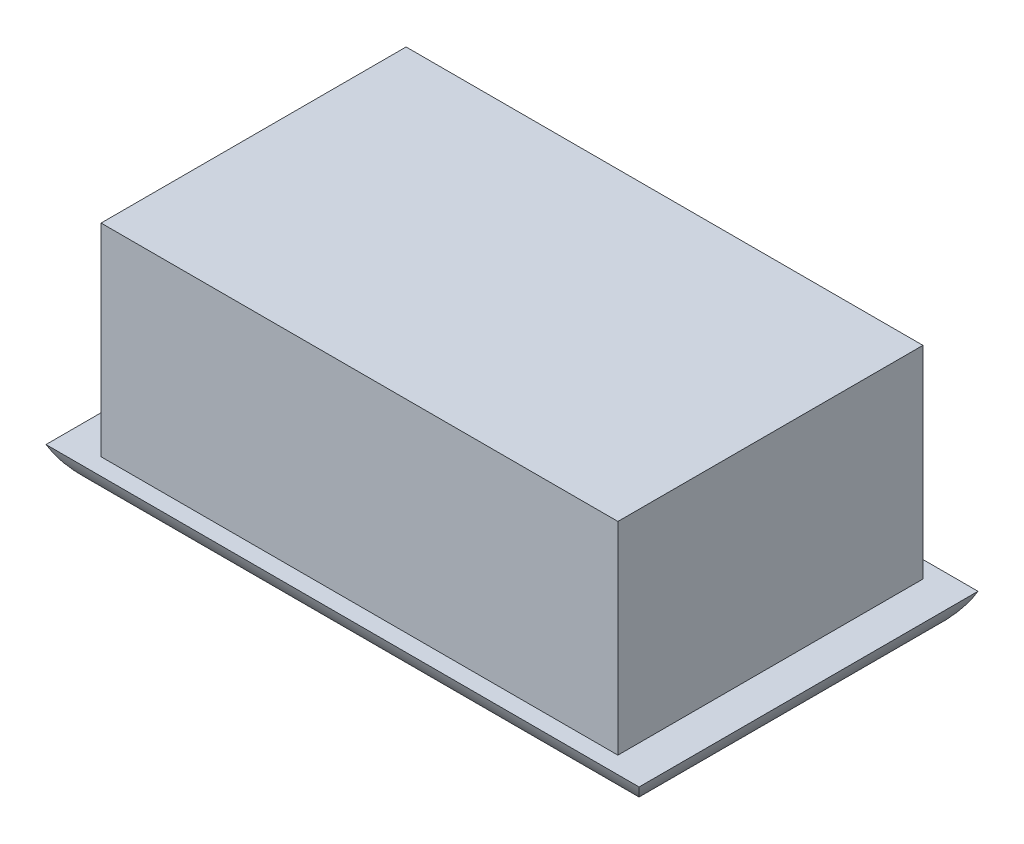
ISO-10303-21;
HEADER;
FILE_DESCRIPTION(('STEP AP214'),'2;1');
FILE_NAME('part.step','',(''),(''),'','','');
FILE_SCHEMA(('AUTOMOTIVE_DESIGN { 1 0 10303 214 1 1 1 1 }'));
ENDSEC;
DATA;
#1=APPLICATION_CONTEXT('core data for automotive mechanical design processes');
#2=APPLICATION_PROTOCOL_DEFINITION('international standard','automotive_design',2000,#1);
#3=PRODUCT_CONTEXT('',#1,'mechanical');
#4=PRODUCT('Part','Part','',(#3));
#5=PRODUCT_RELATED_PRODUCT_CATEGORY('part','',(#4));
#6=PRODUCT_DEFINITION_FORMATION('','',#4);
#7=PRODUCT_DEFINITION_CONTEXT('part definition',#1,'design');
#8=PRODUCT_DEFINITION('design','',#6,#7);
#9=PRODUCT_DEFINITION_SHAPE('','',#8);
#10=(LENGTH_UNIT() NAMED_UNIT(*) SI_UNIT(.MILLI.,.METRE.));
#11=(NAMED_UNIT(*) PLANE_ANGLE_UNIT() SI_UNIT($,.RADIAN.));
#12=(NAMED_UNIT(*) SI_UNIT($,.STERADIAN.) SOLID_ANGLE_UNIT());
#13=UNCERTAINTY_MEASURE_WITH_UNIT(LENGTH_MEASURE(1.E-05),#10,'distance_accuracy_value','');
#14=(GEOMETRIC_REPRESENTATION_CONTEXT(3) GLOBAL_UNCERTAINTY_ASSIGNED_CONTEXT((#13)) GLOBAL_UNIT_ASSIGNED_CONTEXT((#10,
#11,#12)) REPRESENTATION_CONTEXT('',''));
#15=CARTESIAN_POINT('',(0.,0.,0.));
#16=DIRECTION('',(0.,0.,1.));
#17=DIRECTION('',(1.,0.,0.));
#18=AXIS2_PLACEMENT_3D('',#15,#16,#17);
#19=CARTESIAN_POINT('',(25.7872555341905,-20.,-20.));
#20=DIRECTION('',(0.,0.,-1.));
#21=DIRECTION('',(-1.,0.,0.));
#22=AXIS2_PLACEMENT_3D('',#19,#20,#21);
#23=CYLINDRICAL_SURFACE('',#22,10.);
#24=CARTESIAN_POINT('',(25.7872555341905,-20.,-10.7872555341905));
#25=DIRECTION('',(0.707106781186548,0.,0.707106781186548));
#26=DIRECTION('',(-0.707106781186548,0.,0.707106781186548));
#27=AXIS2_PLACEMENT_3D('',#24,#25,#26);
#28=ELLIPSE('',#27,14.1421356237309,10.);
#29=CARTESIAN_POINT('',(25.7872555341905,-30.,-10.7872555341905));
#30=VERTEX_POINT('',#29);
#31=CARTESIAN_POINT('',(35.,-23.8891309321872,-20.));
#32=VERTEX_POINT('',#31);
#33=EDGE_CURVE('E20',#30,#32,#28,.T.);
#34=ORIENTED_EDGE('',*,*,#33,.T.);
#35=DIRECTION('',(0.,0.,1.));
#36=VECTOR('',#35,1.);
#37=CARTESIAN_POINT('',(35.,-23.8891309321872,-20.));
#38=LINE('',#37,#36);
#39=CARTESIAN_POINT('',(35.,-23.8891309321872,20.));
#40=VERTEX_POINT('',#39);
#41=EDGE_CURVE('E195',#32,#40,#38,.T.);
#42=ORIENTED_EDGE('',*,*,#41,.T.);
#43=CARTESIAN_POINT('',(25.7872555341905,-20.,10.7872555341905));
#44=DIRECTION('',(0.707106781186548,0.,-0.707106781186548));
#45=DIRECTION('',(0.707106781186548,0.,0.707106781186548));
#46=AXIS2_PLACEMENT_3D('',#43,#44,#45);
#47=ELLIPSE('',#46,14.1421356237309,10.);
#48=CARTESIAN_POINT('',(25.7872555341905,-30.,10.7872555341905));
#49=VERTEX_POINT('',#48);
#50=EDGE_CURVE('E11',#40,#49,#47,.T.);
#51=ORIENTED_EDGE('',*,*,#50,.T.);
#52=DIRECTION('',(0.,0.,1.));
#53=VECTOR('',#52,1.);
#54=CARTESIAN_POINT('',(25.7872555341905,-30.,20.));
#55=LINE('',#54,#53);
#56=EDGE_CURVE('E258',#30,#49,#55,.T.);
#57=ORIENTED_EDGE('',*,*,#56,.F.);
#58=EDGE_LOOP('',(#34,#42,#51,#57));
#59=FACE_BOUND('',#58,.T.);
#60=ADVANCED_FACE('F17',(#59),#23,.T.);
#61=CARTESIAN_POINT('',(35.,-20.,10.7872555341905));
#62=DIRECTION('',(1.,0.,0.));
#63=DIRECTION('',(0.,0.,-1.));
#64=AXIS2_PLACEMENT_3D('',#61,#62,#63);
#65=CYLINDRICAL_SURFACE('',#64,10.);
#66=CARTESIAN_POINT('',(19.3495577730773,-20.,10.7872555341905));
#67=DIRECTION('',(-0.707106781186548,0.,-0.707106781186548));
#68=DIRECTION('',(0.707106781186548,0.,-0.707106781186548));
#69=AXIS2_PLACEMENT_3D('',#66,#67,#68);
#70=ELLIPSE('',#69,14.1421356237309,10.);
#71=CARTESIAN_POINT('',(19.3495577730773,-30.,10.7872555341905));
#72=VERTEX_POINT('',#71);
#73=CARTESIAN_POINT('',(17.5684066536339,-29.8400965792875,12.5684066536339));
#74=VERTEX_POINT('',#73);
#75=EDGE_CURVE('E219',#72,#74,#70,.T.);
#76=ORIENTED_EDGE('',*,*,#75,.F.);
#77=DIRECTION('',(-1.,0.,0.));
#78=VECTOR('',#77,1.);
#79=CARTESIAN_POINT('',(-35.,-30.,10.7872555341905));
#80=LINE('',#79,#78);
#81=EDGE_CURVE('E616',#49,#72,#80,.T.);
#82=ORIENTED_EDGE('',*,*,#81,.F.);
#83=ORIENTED_EDGE('',*,*,#50,.F.);
#84=DIRECTION('',(-1.,0.,0.));
#85=VECTOR('',#84,1.);
#86=CARTESIAN_POINT('',(35.,-23.8891309321872,20.));
#87=LINE('',#86,#85);
#88=CARTESIAN_POINT('',(-35.,-23.8891309321872,20.));
#89=VERTEX_POINT('',#88);
#90=EDGE_CURVE('E191',#40,#89,#87,.T.);
#91=ORIENTED_EDGE('',*,*,#90,.T.);
#92=CARTESIAN_POINT('',(-25.7872555341905,-20.,10.7872555341905));
#93=DIRECTION('',(0.707106781186548,0.,0.707106781186548));
#94=DIRECTION('',(-0.707106781186548,0.,0.707106781186548));
#95=AXIS2_PLACEMENT_3D('',#92,#93,#94);
#96=ELLIPSE('',#95,14.1421356237309,10.);
#97=CARTESIAN_POINT('',(-25.7872555341905,-30.,10.7872555341905));
#98=VERTEX_POINT('',#97);
#99=EDGE_CURVE('E242',#89,#98,#96,.T.);
#100=ORIENTED_EDGE('',*,*,#99,.T.);
#101=DIRECTION('',(-1.,0.,0.));
#102=VECTOR('',#101,1.);
#103=CARTESIAN_POINT('',(-35.,-30.,10.7872555341905));
#104=LINE('',#103,#102);
#105=CARTESIAN_POINT('',(-19.3495577730773,-30.,10.7872555341905));
#106=VERTEX_POINT('',#105);
#107=EDGE_CURVE('E211',#106,#98,#104,.T.);
#108=ORIENTED_EDGE('',*,*,#107,.F.);
#109=CARTESIAN_POINT('',(-19.3495577730773,-20.,10.7872555341905));
#110=DIRECTION('',(0.707106781186548,0.,-0.707106781186548));
#111=DIRECTION('',(0.707106781186548,0.,0.707106781186548));
#112=AXIS2_PLACEMENT_3D('',#109,#110,#111);
#113=ELLIPSE('',#112,14.1421356237309,10.);
#114=CARTESIAN_POINT('',(-17.5684066536339,-29.8400965792875,12.5684066536339));
#115=VERTEX_POINT('',#114);
#116=EDGE_CURVE('E148',#115,#106,#113,.T.);
#117=ORIENTED_EDGE('',*,*,#116,.F.);
#118=DIRECTION('',(-1.,0.,0.));
#119=VECTOR('',#118,1.);
#120=CARTESIAN_POINT('',(17.5684066536339,-29.8400965792875,12.5684066536339));
#121=LINE('',#120,#119);
#122=EDGE_CURVE('E39',#74,#115,#121,.T.);
#123=ORIENTED_EDGE('',*,*,#122,.F.);
#124=EDGE_LOOP('',(#76,#82,#83,#91,#100,#108,#117,#123));
#125=FACE_BOUND('',#124,.T.);
#126=ADVANCED_FACE('F269',(#125),#65,.T.);
#127=CARTESIAN_POINT('',(-35.,-20.,-10.7872555341905));
#128=DIRECTION('',(-1.,0.,0.));
#129=DIRECTION('',(0.,0.,1.));
#130=AXIS2_PLACEMENT_3D('',#127,#128,#129);
#131=CYLINDRICAL_SURFACE('',#130,10.);
#132=CARTESIAN_POINT('',(-25.7872555341905,-20.,-10.7872555341905));
#133=DIRECTION('',(0.707106781186548,0.,-0.707106781186548));
#134=DIRECTION('',(0.707106781186548,0.,0.707106781186548));
#135=AXIS2_PLACEMENT_3D('',#132,#133,#134);
#136=ELLIPSE('',#135,14.1421356237309,10.);
#137=CARTESIAN_POINT('',(-25.7872555341905,-30.,-10.7872555341905));
#138=VERTEX_POINT('',#137);
#139=CARTESIAN_POINT('',(-35.,-23.8891309321872,-20.));
#140=VERTEX_POINT('',#139);
#141=EDGE_CURVE('E244',#138,#140,#136,.T.);
#142=ORIENTED_EDGE('',*,*,#141,.T.);
#143=DIRECTION('',(1.,0.,0.));
#144=VECTOR('',#143,1.);
#145=CARTESIAN_POINT('',(-35.,-23.8891309321872,-20.));
#146=LINE('',#145,#144);
#147=EDGE_CURVE('E183',#140,#32,#146,.T.);
#148=ORIENTED_EDGE('',*,*,#147,.T.);
#149=ORIENTED_EDGE('',*,*,#33,.F.);
#150=DIRECTION('',(1.,0.,0.));
#151=VECTOR('',#150,1.);
#152=CARTESIAN_POINT('',(35.,-30.,-10.7872555341905));
#153=LINE('',#152,#151);
#154=CARTESIAN_POINT('',(19.3495577730773,-30.,-10.7872555341905));
#155=VERTEX_POINT('',#154);
#156=EDGE_CURVE('E626',#155,#30,#153,.T.);
#157=ORIENTED_EDGE('',*,*,#156,.F.);
#158=CARTESIAN_POINT('',(19.3495577730773,-20.,-10.7872555341905));
#159=DIRECTION('',(-0.707106781186548,0.,0.707106781186548));
#160=DIRECTION('',(-0.707106781186548,0.,-0.707106781186548));
#161=AXIS2_PLACEMENT_3D('',#158,#159,#160);
#162=ELLIPSE('',#161,14.1421356237309,10.);
#163=CARTESIAN_POINT('',(17.5684066536339,-29.8400965792875,-12.5684066536339));
#164=VERTEX_POINT('',#163);
#165=EDGE_CURVE('E215',#164,#155,#162,.T.);
#166=ORIENTED_EDGE('',*,*,#165,.F.);
#167=DIRECTION('',(1.,0.,0.));
#168=VECTOR('',#167,1.);
#169=CARTESIAN_POINT('',(-17.5684066536339,-29.8400965792875,-12.5684066536339));
#170=LINE('',#169,#168);
#171=CARTESIAN_POINT('',(-17.5684066536339,-29.8400965792875,-12.5684066536339));
#172=VERTEX_POINT('',#171);
#173=EDGE_CURVE('E225',#172,#164,#170,.T.);
#174=ORIENTED_EDGE('',*,*,#173,.F.);
#175=CARTESIAN_POINT('',(-19.3495577730773,-20.,-10.7872555341905));
#176=DIRECTION('',(0.707106781186548,0.,0.707106781186548));
#177=DIRECTION('',(-0.707106781186548,0.,0.707106781186548));
#178=AXIS2_PLACEMENT_3D('',#175,#176,#177);
#179=ELLIPSE('',#178,14.1421356237309,10.);
#180=CARTESIAN_POINT('',(-19.3495577730773,-30.,-10.7872555341905));
#181=VERTEX_POINT('',#180);
#182=EDGE_CURVE('E149',#181,#172,#179,.T.);
#183=ORIENTED_EDGE('',*,*,#182,.F.);
#184=DIRECTION('',(1.,0.,0.));
#185=VECTOR('',#184,1.);
#186=CARTESIAN_POINT('',(35.,-30.,-10.7872555341905));
#187=LINE('',#186,#185);
#188=EDGE_CURVE('E203',#138,#181,#187,.T.);
#189=ORIENTED_EDGE('',*,*,#188,.F.);
#190=EDGE_LOOP('',(#142,#148,#149,#157,#166,#174,#183,#189));
#191=FACE_BOUND('',#190,.T.);
#192=ADVANCED_FACE('F266',(#191),#131,.T.);
#193=CARTESIAN_POINT('',(-25.7872555341905,-20.,20.));
#194=DIRECTION('',(0.,0.,1.));
#195=DIRECTION('',(1.,0.,0.));
#196=AXIS2_PLACEMENT_3D('',#193,#194,#195);
#197=CYLINDRICAL_SURFACE('',#196,10.);
#198=ORIENTED_EDGE('',*,*,#99,.F.);
#199=DIRECTION('',(0.,0.,-1.));
#200=VECTOR('',#199,1.);
#201=CARTESIAN_POINT('',(-35.,-23.8891309321872,20.));
#202=LINE('',#201,#200);
#203=EDGE_CURVE('E187',#89,#140,#202,.T.);
#204=ORIENTED_EDGE('',*,*,#203,.T.);
#205=ORIENTED_EDGE('',*,*,#141,.F.);
#206=DIRECTION('',(0.,0.,-1.));
#207=VECTOR('',#206,1.);
#208=CARTESIAN_POINT('',(-25.7872555341905,-30.,-20.));
#209=LINE('',#208,#207);
#210=EDGE_CURVE('E199',#98,#138,#209,.T.);
#211=ORIENTED_EDGE('',*,*,#210,.F.);
#212=EDGE_LOOP('',(#198,#204,#205,#211));
#213=FACE_BOUND('',#212,.T.);
#214=ADVANCED_FACE('F268',(#213),#197,.T.);
#215=CARTESIAN_POINT('',(12.5,-20.,14.3495577730773));
#216=DIRECTION('',(1.,0.,0.));
#217=DIRECTION('',(0.,0.,-1.));
#218=AXIS2_PLACEMENT_3D('',#215,#216,#217);
#219=CYLINDRICAL_SURFACE('',#218,10.);
#220=CARTESIAN_POINT('',(19.3495577730773,-20.,14.3495577730773));
#221=DIRECTION('',(-0.707106781186548,0.,0.707106781186548));
#222=DIRECTION('',(0.707106781186548,0.,0.707106781186548));
#223=AXIS2_PLACEMENT_3D('',#220,#221,#222);
#224=ELLIPSE('',#223,14.1421356237309,10.);
#225=CARTESIAN_POINT('',(12.5,-27.2858464376678,7.5));
#226=VERTEX_POINT('',#225);
#227=EDGE_CURVE('E235',#226,#74,#224,.T.);
#228=ORIENTED_EDGE('',*,*,#227,.T.);
#229=ORIENTED_EDGE('',*,*,#122,.T.);
#230=CARTESIAN_POINT('',(-19.3495577730773,-20.,14.3495577730773));
#231=DIRECTION('',(0.707106781186548,0.,0.707106781186548));
#232=DIRECTION('',(0.707106781186548,0.,-0.707106781186548));
#233=AXIS2_PLACEMENT_3D('',#230,#231,#232);
#234=ELLIPSE('',#233,14.1421356237309,10.);
#235=CARTESIAN_POINT('',(-12.5,-27.2858464376678,7.5));
#236=VERTEX_POINT('',#235);
#237=EDGE_CURVE('E140',#115,#236,#234,.T.);
#238=ORIENTED_EDGE('',*,*,#237,.T.);
#239=DIRECTION('',(-1.,0.,0.));
#240=VECTOR('',#239,1.);
#241=CARTESIAN_POINT('',(12.5,-27.2858464376678,7.5));
#242=LINE('',#241,#240);
#243=EDGE_CURVE('E144',#226,#236,#242,.T.);
#244=ORIENTED_EDGE('',*,*,#243,.F.);
#245=EDGE_LOOP('',(#228,#229,#238,#244));
#246=FACE_BOUND('',#245,.T.);
#247=ADVANCED_FACE('F142',(#246),#219,.T.);
#248=CARTESIAN_POINT('',(-19.3495577730773,-20.,7.5));
#249=DIRECTION('',(0.,0.,1.));
#250=DIRECTION('',(1.,0.,0.));
#251=AXIS2_PLACEMENT_3D('',#248,#249,#250);
#252=CYLINDRICAL_SURFACE('',#251,10.);
#253=DIRECTION('',(0.,0.,1.));
#254=VECTOR('',#253,1.);
#255=CARTESIAN_POINT('',(-19.3495577730773,-30.,7.5));
#256=LINE('',#255,#254);
#257=EDGE_CURVE('E207',#181,#106,#256,.T.);
#258=ORIENTED_EDGE('',*,*,#257,.F.);
#259=ORIENTED_EDGE('',*,*,#182,.T.);
#260=CARTESIAN_POINT('',(-19.3495577730773,-20.,-14.3495577730773));
#261=DIRECTION('',(-0.707106781186548,0.,0.707106781186548));
#262=DIRECTION('',(0.707106781186548,0.,0.707106781186548));
#263=AXIS2_PLACEMENT_3D('',#260,#261,#262);
#264=ELLIPSE('',#263,14.1421356237309,10.);
#265=CARTESIAN_POINT('',(-12.5,-27.2858464376678,-7.5));
#266=VERTEX_POINT('',#265);
#267=EDGE_CURVE('E156',#172,#266,#264,.T.);
#268=ORIENTED_EDGE('',*,*,#267,.T.);
#269=DIRECTION('',(0.,0.,-1.));
#270=VECTOR('',#269,1.);
#271=CARTESIAN_POINT('',(-12.5,-27.2858464376678,7.5));
#272=LINE('',#271,#270);
#273=EDGE_CURVE('E152',#236,#266,#272,.T.);
#274=ORIENTED_EDGE('',*,*,#273,.F.);
#275=ORIENTED_EDGE('',*,*,#237,.F.);
#276=ORIENTED_EDGE('',*,*,#116,.T.);
#277=EDGE_LOOP('',(#258,#259,#268,#274,#275,#276));
#278=FACE_BOUND('',#277,.T.);
#279=ADVANCED_FACE('F154',(#278),#252,.T.);
#280=CARTESIAN_POINT('',(19.3495577730773,-20.,-7.5));
#281=DIRECTION('',(0.,0.,-1.));
#282=DIRECTION('',(-1.,0.,0.));
#283=AXIS2_PLACEMENT_3D('',#280,#281,#282);
#284=CYLINDRICAL_SURFACE('',#283,10.);
#285=CARTESIAN_POINT('',(19.3495577730773,-20.,-14.3495577730773));
#286=DIRECTION('',(0.707106781186548,0.,0.707106781186548));
#287=DIRECTION('',(0.707106781186548,0.,-0.707106781186548));
#288=AXIS2_PLACEMENT_3D('',#285,#286,#287);
#289=ELLIPSE('',#288,14.1421356237309,10.);
#290=CARTESIAN_POINT('',(12.5,-27.2858464376678,-7.5));
#291=VERTEX_POINT('',#290);
#292=EDGE_CURVE('E220',#291,#164,#289,.T.);
#293=ORIENTED_EDGE('',*,*,#292,.T.);
#294=ORIENTED_EDGE('',*,*,#165,.T.);
#295=DIRECTION('',(0.,0.,-1.));
#296=VECTOR('',#295,1.);
#297=CARTESIAN_POINT('',(19.3495577730773,-30.,-7.5));
#298=LINE('',#297,#296);
#299=EDGE_CURVE('E631',#72,#155,#298,.T.);
#300=ORIENTED_EDGE('',*,*,#299,.F.);
#301=ORIENTED_EDGE('',*,*,#75,.T.);
#302=ORIENTED_EDGE('',*,*,#227,.F.);
#303=DIRECTION('',(0.,0.,1.));
#304=VECTOR('',#303,1.);
#305=CARTESIAN_POINT('',(12.5,-27.2858464376678,-7.5));
#306=LINE('',#305,#304);
#307=EDGE_CURVE('E164',#291,#226,#306,.T.);
#308=ORIENTED_EDGE('',*,*,#307,.F.);
#309=EDGE_LOOP('',(#293,#294,#300,#301,#302,#308));
#310=FACE_BOUND('',#309,.T.);
#311=ADVANCED_FACE('F328',(#310),#284,.T.);
#312=CARTESIAN_POINT('',(-12.5,-20.,-14.3495577730773));
#313=DIRECTION('',(-1.,0.,0.));
#314=DIRECTION('',(0.,0.,1.));
#315=AXIS2_PLACEMENT_3D('',#312,#313,#314);
#316=CYLINDRICAL_SURFACE('',#315,10.);
#317=ORIENTED_EDGE('',*,*,#267,.F.);
#318=ORIENTED_EDGE('',*,*,#173,.T.);
#319=ORIENTED_EDGE('',*,*,#292,.F.);
#320=DIRECTION('',(1.,0.,0.));
#321=VECTOR('',#320,1.);
#322=CARTESIAN_POINT('',(-12.5,-27.2858464376678,-7.5));
#323=LINE('',#322,#321);
#324=EDGE_CURVE('E171',#266,#291,#323,.T.);
#325=ORIENTED_EDGE('',*,*,#324,.F.);
#326=EDGE_LOOP('',(#317,#318,#319,#325));
#327=FACE_BOUND('',#326,.T.);
#328=ADVANCED_FACE('F339',(#327),#316,.T.);
#329=CARTESIAN_POINT('',(0.,-27.2858464376678,0.));
#330=DIRECTION('',(0.,-1.,0.));
#331=DIRECTION('',(0.,0.,-1.));
#332=AXIS2_PLACEMENT_3D('',#329,#330,#331);
#333=PLANE('',#332);
#334=ORIENTED_EDGE('',*,*,#324,.T.);
#335=ORIENTED_EDGE('',*,*,#307,.T.);
#336=ORIENTED_EDGE('',*,*,#243,.T.);
#337=ORIENTED_EDGE('',*,*,#273,.T.);
#338=EDGE_LOOP('',(#334,#335,#336,#337));
#339=FACE_BOUND('',#338,.T.);
#340=ADVANCED_FACE('F162',(#339),#333,.T.);
#341=CARTESIAN_POINT('',(0.,-30.,0.));
#342=DIRECTION('',(0.,-1.,0.));
#343=DIRECTION('',(0.,0.,-1.));
#344=AXIS2_PLACEMENT_3D('',#341,#342,#343);
#345=PLANE('',#344);
#346=ORIENTED_EDGE('',*,*,#210,.T.);
#347=ORIENTED_EDGE('',*,*,#188,.T.);
#348=ORIENTED_EDGE('',*,*,#257,.T.);
#349=ORIENTED_EDGE('',*,*,#107,.T.);
#350=EDGE_LOOP('',(#346,#347,#348,#349));
#351=FACE_BOUND('',#350,.T.);
#352=ADVANCED_FACE('F360',(#351),#345,.T.);
#353=CARTESIAN_POINT('',(0.,-23.8891309321872,0.));
#354=DIRECTION('',(0.,-1.,0.));
#355=DIRECTION('',(0.,0.,-1.));
#356=AXIS2_PLACEMENT_3D('',#353,#354,#355);
#357=PLANE('',#356);
#358=ORIENTED_EDGE('',*,*,#147,.F.);
#359=ORIENTED_EDGE('',*,*,#203,.F.);
#360=ORIENTED_EDGE('',*,*,#90,.F.);
#361=ORIENTED_EDGE('',*,*,#41,.F.);
#362=EDGE_LOOP('',(#358,#359,#360,#361));
#363=FACE_BOUND('',#362,.T.);
#364=DIRECTION('',(0.,0.,1.));
#365=VECTOR('',#364,1.);
#366=CARTESIAN_POINT('',(30.5,-23.8891309321872,-18.));
#367=LINE('',#366,#365);
#368=CARTESIAN_POINT('',(30.5,-23.8891309321872,-18.));
#369=VERTEX_POINT('',#368);
#370=CARTESIAN_POINT('',(30.5,-23.8891309321872,18.));
#371=VERTEX_POINT('',#370);
#372=EDGE_CURVE('E582',#369,#371,#367,.T.);
#373=ORIENTED_EDGE('',*,*,#372,.T.);
#374=DIRECTION('',(-1.,0.,0.));
#375=VECTOR('',#374,1.);
#376=CARTESIAN_POINT('',(30.5,-23.8891309321872,18.));
#377=LINE('',#376,#375);
#378=CARTESIAN_POINT('',(-30.5,-23.8891309321872,18.));
#379=VERTEX_POINT('',#378);
#380=EDGE_CURVE('E559',#371,#379,#377,.T.);
#381=ORIENTED_EDGE('',*,*,#380,.T.);
#382=DIRECTION('',(0.,0.,-1.));
#383=VECTOR('',#382,1.);
#384=CARTESIAN_POINT('',(-30.5,-23.8891309321872,18.));
#385=LINE('',#384,#383);
#386=CARTESIAN_POINT('',(-30.5,-23.8891309321872,-18.));
#387=VERTEX_POINT('',#386);
#388=EDGE_CURVE('E177',#379,#387,#385,.T.);
#389=ORIENTED_EDGE('',*,*,#388,.T.);
#390=DIRECTION('',(1.,0.,0.));
#391=VECTOR('',#390,1.);
#392=CARTESIAN_POINT('',(-30.5,-23.8891309321872,-18.));
#393=LINE('',#392,#391);
#394=EDGE_CURVE('E610',#387,#369,#393,.T.);
#395=ORIENTED_EDGE('',*,*,#394,.T.);
#396=EDGE_LOOP('',(#373,#381,#389,#395));
#397=FACE_BOUND('',#396,.T.);
#398=ADVANCED_FACE('F263',(#363,#397),#357,.F.);
#399=CARTESIAN_POINT('',(0.,0.,0.));
#400=DIRECTION('',(0.,-1.,0.));
#401=DIRECTION('',(0.,0.,-1.));
#402=AXIS2_PLACEMENT_3D('',#399,#400,#401);
#403=PLANE('',#402);
#404=DIRECTION('',(1.,0.,0.));
#405=VECTOR('',#404,1.);
#406=CARTESIAN_POINT('',(-30.5,0.,-18.));
#407=LINE('',#406,#405);
#408=CARTESIAN_POINT('',(-30.5,0.,-18.));
#409=VERTEX_POINT('',#408);
#410=CARTESIAN_POINT('',(30.5,0.,-18.));
#411=VERTEX_POINT('',#410);
#412=EDGE_CURVE('E595',#409,#411,#407,.T.);
#413=ORIENTED_EDGE('',*,*,#412,.F.);
#414=DIRECTION('',(0.,0.,-1.));
#415=VECTOR('',#414,1.);
#416=CARTESIAN_POINT('',(-30.5,0.,18.));
#417=LINE('',#416,#415);
#418=CARTESIAN_POINT('',(-30.5,0.,18.));
#419=VERTEX_POINT('',#418);
#420=EDGE_CURVE('E180',#419,#409,#417,.T.);
#421=ORIENTED_EDGE('',*,*,#420,.F.);
#422=DIRECTION('',(-1.,0.,0.));
#423=VECTOR('',#422,1.);
#424=CARTESIAN_POINT('',(30.5,0.,18.));
#425=LINE('',#424,#423);
#426=CARTESIAN_POINT('',(30.5,0.,18.));
#427=VERTEX_POINT('',#426);
#428=EDGE_CURVE('E552',#427,#419,#425,.T.);
#429=ORIENTED_EDGE('',*,*,#428,.F.);
#430=DIRECTION('',(0.,0.,1.));
#431=VECTOR('',#430,1.);
#432=CARTESIAN_POINT('',(30.5,0.,-18.));
#433=LINE('',#432,#431);
#434=EDGE_CURVE('E574',#411,#427,#433,.T.);
#435=ORIENTED_EDGE('',*,*,#434,.F.);
#436=EDGE_LOOP('',(#413,#421,#429,#435));
#437=FACE_BOUND('',#436,.T.);
#438=ADVANCED_FACE('F379',(#437),#403,.F.);
#439=CARTESIAN_POINT('',(-30.5,-30.,18.));
#440=DIRECTION('',(1.,0.,0.));
#441=DIRECTION('',(0.,1.,0.));
#442=AXIS2_PLACEMENT_3D('',#439,#440,#441);
#443=PLANE('',#442);
#444=ORIENTED_EDGE('',*,*,#388,.F.);
#445=DIRECTION('',(0.,1.,0.));
#446=VECTOR('',#445,1.);
#447=CARTESIAN_POINT('',(-30.5,-30.,18.));
#448=LINE('',#447,#446);
#449=EDGE_CURVE('E175',#379,#419,#448,.T.);
#450=ORIENTED_EDGE('',*,*,#449,.T.);
#451=ORIENTED_EDGE('',*,*,#420,.T.);
#452=DIRECTION('',(0.,1.,0.));
#453=VECTOR('',#452,1.);
#454=CARTESIAN_POINT('',(-30.5,-30.,-18.));
#455=LINE('',#454,#453);
#456=EDGE_CURVE('E602',#387,#409,#455,.T.);
#457=ORIENTED_EDGE('',*,*,#456,.F.);
#458=EDGE_LOOP('',(#444,#450,#451,#457));
#459=FACE_BOUND('',#458,.T.);
#460=ADVANCED_FACE('F388',(#459),#443,.F.);
#461=CARTESIAN_POINT('',(30.5,-30.,18.));
#462=DIRECTION('',(0.,0.,-1.));
#463=DIRECTION('',(0.,-1.,0.));
#464=AXIS2_PLACEMENT_3D('',#461,#462,#463);
#465=PLANE('',#464);
#466=ORIENTED_EDGE('',*,*,#380,.F.);
#467=DIRECTION('',(0.,1.,0.));
#468=VECTOR('',#467,1.);
#469=CARTESIAN_POINT('',(30.5,-30.,18.));
#470=LINE('',#469,#468);
#471=EDGE_CURVE('E567',#371,#427,#470,.T.);
#472=ORIENTED_EDGE('',*,*,#471,.T.);
#473=ORIENTED_EDGE('',*,*,#428,.T.);
#474=ORIENTED_EDGE('',*,*,#449,.F.);
#475=EDGE_LOOP('',(#466,#472,#473,#474));
#476=FACE_BOUND('',#475,.T.);
#477=ADVANCED_FACE('F399',(#476),#465,.F.);
#478=CARTESIAN_POINT('',(30.5,-30.,-18.));
#479=DIRECTION('',(-1.,0.,0.));
#480=DIRECTION('',(0.,0.,1.));
#481=AXIS2_PLACEMENT_3D('',#478,#479,#480);
#482=PLANE('',#481);
#483=ORIENTED_EDGE('',*,*,#372,.F.);
#484=DIRECTION('',(0.,1.,0.));
#485=VECTOR('',#484,1.);
#486=CARTESIAN_POINT('',(30.5,-30.,-18.));
#487=LINE('',#486,#485);
#488=EDGE_CURVE('E588',#369,#411,#487,.T.);
#489=ORIENTED_EDGE('',*,*,#488,.T.);
#490=ORIENTED_EDGE('',*,*,#434,.T.);
#491=ORIENTED_EDGE('',*,*,#471,.F.);
#492=EDGE_LOOP('',(#483,#489,#490,#491));
#493=FACE_BOUND('',#492,.T.);
#494=ADVANCED_FACE('F409',(#493),#482,.F.);
#495=CARTESIAN_POINT('',(-30.5,-30.,-18.));
#496=DIRECTION('',(0.,0.,1.));
#497=DIRECTION('',(1.,0.,0.));
#498=AXIS2_PLACEMENT_3D('',#495,#496,#497);
#499=PLANE('',#498);
#500=ORIENTED_EDGE('',*,*,#394,.F.);
#501=ORIENTED_EDGE('',*,*,#456,.T.);
#502=ORIENTED_EDGE('',*,*,#412,.T.);
#503=ORIENTED_EDGE('',*,*,#488,.F.);
#504=EDGE_LOOP('',(#500,#501,#502,#503));
#505=FACE_BOUND('',#504,.T.);
#506=ADVANCED_FACE('F419',(#505),#499,.F.);
#507=CARTESIAN_POINT('',(0.,-30.,0.));
#508=DIRECTION('',(0.,-1.,0.));
#509=DIRECTION('',(0.,0.,-1.));
#510=AXIS2_PLACEMENT_3D('',#507,#508,#509);
#511=PLANE('',#510);
#512=ORIENTED_EDGE('',*,*,#299,.T.);
#513=ORIENTED_EDGE('',*,*,#156,.T.);
#514=ORIENTED_EDGE('',*,*,#56,.T.);
#515=ORIENTED_EDGE('',*,*,#81,.T.);
#516=EDGE_LOOP('',(#512,#513,#514,#515));
#517=FACE_BOUND('',#516,.T.);
#518=ADVANCED_FACE('F430',(#517),#511,.T.);
#519=CLOSED_SHELL('',(#60,#126,#192,#214,#247,#279,#311,#328,#340,#352,#398,#438,#460,#477,#494,
#506,#518));
#520=MANIFOLD_SOLID_BREP('B1',#519);
#521=ADVANCED_BREP_SHAPE_REPRESENTATION('',(#18,#520),#14);
#522=SHAPE_DEFINITION_REPRESENTATION(#9,#521);
ENDSEC;
END-ISO-10303-21;
